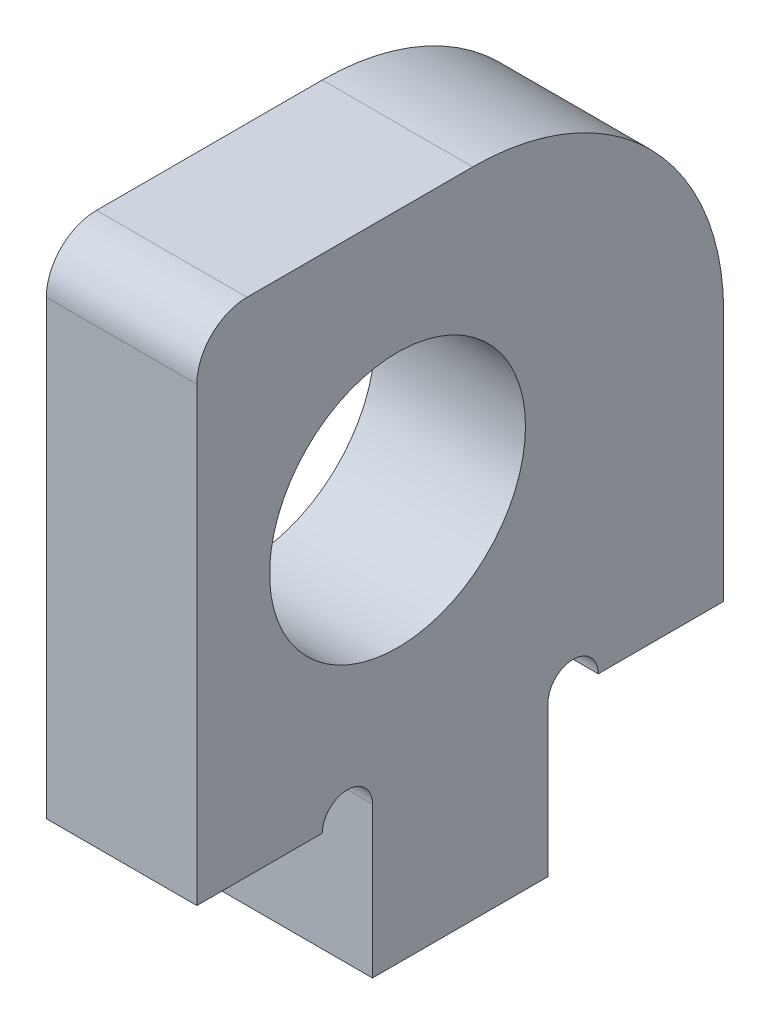
ISO-10303-21;
HEADER;
FILE_DESCRIPTION(('STEP AP214'),'2;1');
FILE_NAME('part.step','',(''),(''),'','','');
FILE_SCHEMA(('AUTOMOTIVE_DESIGN { 1 0 10303 214 1 1 1 1 }'));
ENDSEC;
DATA;
#1=APPLICATION_CONTEXT('core data for automotive mechanical design processes');
#2=APPLICATION_PROTOCOL_DEFINITION('international standard','automotive_design',2000,#1);
#3=PRODUCT_CONTEXT('',#1,'mechanical');
#4=PRODUCT('Part','Part','',(#3));
#5=PRODUCT_RELATED_PRODUCT_CATEGORY('part','',(#4));
#6=PRODUCT_DEFINITION_FORMATION('','',#4);
#7=PRODUCT_DEFINITION_CONTEXT('part definition',#1,'design');
#8=PRODUCT_DEFINITION('design','',#6,#7);
#9=PRODUCT_DEFINITION_SHAPE('','',#8);
#10=(LENGTH_UNIT() NAMED_UNIT(*) SI_UNIT(.MILLI.,.METRE.));
#11=(NAMED_UNIT(*) PLANE_ANGLE_UNIT() SI_UNIT($,.RADIAN.));
#12=(NAMED_UNIT(*) SI_UNIT($,.STERADIAN.) SOLID_ANGLE_UNIT());
#13=UNCERTAINTY_MEASURE_WITH_UNIT(LENGTH_MEASURE(1.E-05),#10,'distance_accuracy_value','');
#14=(GEOMETRIC_REPRESENTATION_CONTEXT(3) GLOBAL_UNCERTAINTY_ASSIGNED_CONTEXT((#13)) GLOBAL_UNIT_ASSIGNED_CONTEXT((#10,
#11,#12)) REPRESENTATION_CONTEXT('',''));
#15=CARTESIAN_POINT('',(0.,0.,0.));
#16=DIRECTION('',(0.,0.,1.));
#17=DIRECTION('',(1.,0.,0.));
#18=AXIS2_PLACEMENT_3D('',#15,#16,#17);
#19=CARTESIAN_POINT('',(6.,0.,0.));
#20=DIRECTION('',(0.,1.,0.));
#21=DIRECTION('',(0.,0.,1.));
#22=AXIS2_PLACEMENT_3D('',#19,#20,#21);
#23=PLANE('',#22);
#24=DIRECTION('',(0.,0.,-1.));
#25=VECTOR('',#24,1.);
#26=CARTESIAN_POINT('',(6.,0.,0.));
#27=LINE('',#26,#25);
#28=CARTESIAN_POINT('',(6.,0.,-16.));
#29=VERTEX_POINT('',#28);
#30=CARTESIAN_POINT('',(6.,0.,-21.));
#31=VERTEX_POINT('',#30);
#32=EDGE_CURVE('E38',#29,#31,#27,.T.);
#33=ORIENTED_EDGE('',*,*,#32,.F.);
#34=DIRECTION('',(1.,0.,0.));
#35=VECTOR('',#34,1.);
#36=CARTESIAN_POINT('',(-4.,0.,-16.));
#37=LINE('',#36,#35);
#38=CARTESIAN_POINT('',(0.,0.,-16.));
#39=VERTEX_POINT('',#38);
#40=EDGE_CURVE('E153',#29,#39,#37,.F.);
#41=ORIENTED_EDGE('',*,*,#40,.T.);
#42=DIRECTION('',(0.,0.,-1.));
#43=VECTOR('',#42,1.);
#44=CARTESIAN_POINT('',(0.,0.,0.));
#45=LINE('',#44,#43);
#46=CARTESIAN_POINT('',(0.,0.,-21.));
#47=VERTEX_POINT('',#46);
#48=EDGE_CURVE('E188',#39,#47,#45,.T.);
#49=ORIENTED_EDGE('',*,*,#48,.T.);
#50=DIRECTION('',(-1.,0.,0.));
#51=VECTOR('',#50,1.);
#52=CARTESIAN_POINT('',(6.,0.,-21.));
#53=LINE('',#52,#51);
#54=EDGE_CURVE('E216',#31,#47,#53,.T.);
#55=ORIENTED_EDGE('',*,*,#54,.F.);
#56=EDGE_LOOP('',(#33,#41,#49,#55));
#57=FACE_BOUND('',#56,.T.);
#58=ADVANCED_FACE('F34',(#57),#23,.F.);
#59=CARTESIAN_POINT('',(6.,0.,0.));
#60=DIRECTION('',(-1.,0.,0.));
#61=DIRECTION('',(0.,0.,1.));
#62=AXIS2_PLACEMENT_3D('',#59,#60,#61);
#63=PLANE('',#62);
#64=CARTESIAN_POINT('',(6.,0.,0.));
#65=VERTEX_POINT('',#64);
#66=CARTESIAN_POINT('',(6.,0.,-5.));
#67=VERTEX_POINT('',#66);
#68=EDGE_CURVE('E147',#65,#67,#27,.T.);
#69=ORIENTED_EDGE('',*,*,#68,.T.);
#70=CARTESIAN_POINT('',(6.,0.,-6.));
#71=DIRECTION('',(1.,0.,0.));
#72=DIRECTION('',(0.,0.,-1.));
#73=AXIS2_PLACEMENT_3D('',#70,#71,#72);
#74=CIRCLE('',#73,1.);
#75=CARTESIAN_POINT('',(6.,0.,-7.));
#76=VERTEX_POINT('',#75);
#77=EDGE_CURVE('E128',#76,#67,#74,.T.);
#78=ORIENTED_EDGE('',*,*,#77,.F.);
#79=DIRECTION('',(0.,-1.,0.));
#80=VECTOR('',#79,1.);
#81=CARTESIAN_POINT('',(6.,0.,-7.));
#82=LINE('',#81,#80);
#83=CARTESIAN_POINT('',(6.,-6.,-7.));
#84=VERTEX_POINT('',#83);
#85=EDGE_CURVE('E145',#76,#84,#82,.T.);
#86=ORIENTED_EDGE('',*,*,#85,.T.);
#87=DIRECTION('',(0.,0.,-1.));
#88=VECTOR('',#87,1.);
#89=CARTESIAN_POINT('',(6.,-6.,-7.));
#90=LINE('',#89,#88);
#91=CARTESIAN_POINT('',(6.,-6.,-14.));
#92=VERTEX_POINT('',#91);
#93=EDGE_CURVE('E152',#84,#92,#90,.T.);
#94=ORIENTED_EDGE('',*,*,#93,.T.);
#95=DIRECTION('',(0.,1.,0.));
#96=VECTOR('',#95,1.);
#97=CARTESIAN_POINT('',(6.,0.,-14.));
#98=LINE('',#97,#96);
#99=CARTESIAN_POINT('',(6.,0.,-14.));
#100=VERTEX_POINT('',#99);
#101=EDGE_CURVE('E155',#92,#100,#98,.T.);
#102=ORIENTED_EDGE('',*,*,#101,.T.);
#103=CARTESIAN_POINT('',(6.,0.,-15.));
#104=DIRECTION('',(1.,0.,0.));
#105=DIRECTION('',(0.,0.,-1.));
#106=AXIS2_PLACEMENT_3D('',#103,#104,#105);
#107=CIRCLE('',#106,1.);
#108=EDGE_CURVE('E257',#29,#100,#107,.T.);
#109=ORIENTED_EDGE('',*,*,#108,.F.);
#110=ORIENTED_EDGE('',*,*,#32,.T.);
#111=DIRECTION('',(0.,1.,0.));
#112=VECTOR('',#111,1.);
#113=CARTESIAN_POINT('',(6.,20.,-21.));
#114=LINE('',#113,#112);
#115=CARTESIAN_POINT('',(6.,10.,-21.));
#116=VERTEX_POINT('',#115);
#117=EDGE_CURVE('E239',#31,#116,#114,.T.);
#118=ORIENTED_EDGE('',*,*,#117,.T.);
#119=CARTESIAN_POINT('',(6.,10.,-11.));
#120=DIRECTION('',(-1.,0.,0.));
#121=DIRECTION('',(0.,0.,1.));
#122=AXIS2_PLACEMENT_3D('',#119,#120,#121);
#123=CIRCLE('',#122,10.);
#124=CARTESIAN_POINT('',(6.,20.,-11.));
#125=VERTEX_POINT('',#124);
#126=EDGE_CURVE('E207',#116,#125,#123,.F.);
#127=ORIENTED_EDGE('',*,*,#126,.T.);
#128=DIRECTION('',(0.,0.,1.));
#129=VECTOR('',#128,1.);
#130=CARTESIAN_POINT('',(6.,20.,0.));
#131=LINE('',#130,#129);
#132=CARTESIAN_POINT('',(6.,20.,-2.));
#133=VERTEX_POINT('',#132);
#134=EDGE_CURVE('E237',#125,#133,#131,.T.);
#135=ORIENTED_EDGE('',*,*,#134,.T.);
#136=CARTESIAN_POINT('',(6.,18.,-2.));
#137=DIRECTION('',(-1.,0.,0.));
#138=DIRECTION('',(0.,0.,1.));
#139=AXIS2_PLACEMENT_3D('',#136,#137,#138);
#140=CIRCLE('',#139,2.);
#141=CARTESIAN_POINT('',(6.,18.,0.));
#142=VERTEX_POINT('',#141);
#143=EDGE_CURVE('E11',#133,#142,#140,.F.);
#144=ORIENTED_EDGE('',*,*,#143,.T.);
#145=DIRECTION('',(0.,-1.,0.));
#146=VECTOR('',#145,1.);
#147=CARTESIAN_POINT('',(6.,0.,0.));
#148=LINE('',#147,#146);
#149=EDGE_CURVE('E195',#142,#65,#148,.T.);
#150=ORIENTED_EDGE('',*,*,#149,.T.);
#151=EDGE_LOOP('',(#69,#78,#86,#94,#102,#109,#110,#118,#127,#135,#144,#150));
#152=FACE_BOUND('',#151,.T.);
#153=CARTESIAN_POINT('',(6.,10.,-8.));
#154=DIRECTION('',(1.,0.,0.));
#155=DIRECTION('',(0.,0.,-1.));
#156=AXIS2_PLACEMENT_3D('',#153,#154,#155);
#157=CIRCLE('',#156,5.1);
#158=CARTESIAN_POINT('',(6.,10.,-13.1));
#159=VERTEX_POINT('',#158);
#160=EDGE_CURVE('E191',#159,#159,#157,.T.);
#161=ORIENTED_EDGE('',*,*,#160,.F.);
#162=EDGE_LOOP('',(#161));
#163=FACE_BOUND('',#162,.T.);
#164=ADVANCED_FACE('F142',(#152,#163),#63,.F.);
#165=CARTESIAN_POINT('',(0.,0.,0.));
#166=DIRECTION('',(-1.,0.,0.));
#167=DIRECTION('',(0.,0.,1.));
#168=AXIS2_PLACEMENT_3D('',#165,#166,#167);
#169=PLANE('',#168);
#170=CARTESIAN_POINT('',(0.,0.,-6.));
#171=DIRECTION('',(-1.,0.,0.));
#172=DIRECTION('',(0.,0.,1.));
#173=AXIS2_PLACEMENT_3D('',#170,#171,#172);
#174=CIRCLE('',#173,1.);
#175=CARTESIAN_POINT('',(0.,0.,-5.));
#176=VERTEX_POINT('',#175);
#177=CARTESIAN_POINT('',(0.,0.,-7.));
#178=VERTEX_POINT('',#177);
#179=EDGE_CURVE('E131',#176,#178,#174,.T.);
#180=ORIENTED_EDGE('',*,*,#179,.F.);
#181=CARTESIAN_POINT('',(0.,0.,0.));
#182=VERTEX_POINT('',#181);
#183=EDGE_CURVE('E190',#182,#176,#45,.T.);
#184=ORIENTED_EDGE('',*,*,#183,.F.);
#185=DIRECTION('',(0.,-1.,0.));
#186=VECTOR('',#185,1.);
#187=CARTESIAN_POINT('',(0.,0.,0.));
#188=LINE('',#187,#186);
#189=CARTESIAN_POINT('',(0.,18.,0.));
#190=VERTEX_POINT('',#189);
#191=EDGE_CURVE('E222',#190,#182,#188,.T.);
#192=ORIENTED_EDGE('',*,*,#191,.F.);
#193=CARTESIAN_POINT('',(0.,18.,-2.));
#194=DIRECTION('',(-1.,0.,0.));
#195=DIRECTION('',(0.,0.,1.));
#196=AXIS2_PLACEMENT_3D('',#193,#194,#195);
#197=CIRCLE('',#196,2.);
#198=CARTESIAN_POINT('',(0.,20.,-2.));
#199=VERTEX_POINT('',#198);
#200=EDGE_CURVE('E59',#190,#199,#197,.T.);
#201=ORIENTED_EDGE('',*,*,#200,.T.);
#202=DIRECTION('',(0.,0.,1.));
#203=VECTOR('',#202,1.);
#204=CARTESIAN_POINT('',(0.,20.,0.));
#205=LINE('',#204,#203);
#206=CARTESIAN_POINT('',(0.,20.,-11.));
#207=VERTEX_POINT('',#206);
#208=EDGE_CURVE('E223',#207,#199,#205,.T.);
#209=ORIENTED_EDGE('',*,*,#208,.F.);
#210=CARTESIAN_POINT('',(0.,10.,-11.));
#211=DIRECTION('',(-1.,0.,0.));
#212=DIRECTION('',(0.,0.,1.));
#213=AXIS2_PLACEMENT_3D('',#210,#211,#212);
#214=CIRCLE('',#213,10.);
#215=CARTESIAN_POINT('',(0.,10.,-21.));
#216=VERTEX_POINT('',#215);
#217=EDGE_CURVE('E211',#207,#216,#214,.T.);
#218=ORIENTED_EDGE('',*,*,#217,.T.);
#219=DIRECTION('',(0.,1.,0.));
#220=VECTOR('',#219,1.);
#221=CARTESIAN_POINT('',(0.,20.,-21.));
#222=LINE('',#221,#220);
#223=EDGE_CURVE('E197',#47,#216,#222,.T.);
#224=ORIENTED_EDGE('',*,*,#223,.F.);
#225=ORIENTED_EDGE('',*,*,#48,.F.);
#226=CARTESIAN_POINT('',(0.,0.,-15.));
#227=DIRECTION('',(-1.,0.,0.));
#228=DIRECTION('',(0.,0.,1.));
#229=AXIS2_PLACEMENT_3D('',#226,#227,#228);
#230=CIRCLE('',#229,1.);
#231=CARTESIAN_POINT('',(0.,0.,-14.));
#232=VERTEX_POINT('',#231);
#233=EDGE_CURVE('E158',#232,#39,#230,.T.);
#234=ORIENTED_EDGE('',*,*,#233,.F.);
#235=DIRECTION('',(0.,1.,0.));
#236=VECTOR('',#235,1.);
#237=CARTESIAN_POINT('',(0.,0.,-14.));
#238=LINE('',#237,#236);
#239=CARTESIAN_POINT('',(0.,-6.,-14.));
#240=VERTEX_POINT('',#239);
#241=EDGE_CURVE('E179',#240,#232,#238,.T.);
#242=ORIENTED_EDGE('',*,*,#241,.F.);
#243=DIRECTION('',(0.,0.,-1.));
#244=VECTOR('',#243,1.);
#245=CARTESIAN_POINT('',(0.,-6.,-7.));
#246=LINE('',#245,#244);
#247=CARTESIAN_POINT('',(0.,-6.,-7.));
#248=VERTEX_POINT('',#247);
#249=EDGE_CURVE('E182',#248,#240,#246,.T.);
#250=ORIENTED_EDGE('',*,*,#249,.F.);
#251=DIRECTION('',(0.,-1.,0.));
#252=VECTOR('',#251,1.);
#253=CARTESIAN_POINT('',(0.,0.,-7.));
#254=LINE('',#253,#252);
#255=EDGE_CURVE('E166',#178,#248,#254,.T.);
#256=ORIENTED_EDGE('',*,*,#255,.F.);
#257=EDGE_LOOP('',(#180,#184,#192,#201,#209,#218,#224,#225,#234,#242,#250,#256));
#258=FACE_BOUND('',#257,.T.);
#259=CARTESIAN_POINT('',(0.,10.,-8.));
#260=DIRECTION('',(1.,0.,0.));
#261=DIRECTION('',(0.,0.,-1.));
#262=AXIS2_PLACEMENT_3D('',#259,#260,#261);
#263=CIRCLE('',#262,5.1);
#264=CARTESIAN_POINT('',(0.,10.,-13.1));
#265=VERTEX_POINT('',#264);
#266=EDGE_CURVE('E136',#265,#265,#263,.T.);
#267=ORIENTED_EDGE('',*,*,#266,.T.);
#268=EDGE_LOOP('',(#267));
#269=FACE_BOUND('',#268,.T.);
#270=ADVANCED_FACE('F264',(#258,#269),#169,.T.);
#271=ORIENTED_EDGE('',*,*,#183,.T.);
#272=DIRECTION('',(1.,0.,0.));
#273=VECTOR('',#272,1.);
#274=CARTESIAN_POINT('',(-4.,0.,-5.));
#275=LINE('',#274,#273);
#276=EDGE_CURVE('E260',#176,#67,#275,.T.);
#277=ORIENTED_EDGE('',*,*,#276,.T.);
#278=ORIENTED_EDGE('',*,*,#68,.F.);
#279=DIRECTION('',(-1.,0.,0.));
#280=VECTOR('',#279,1.);
#281=CARTESIAN_POINT('',(6.,0.,0.));
#282=LINE('',#281,#280);
#283=EDGE_CURVE('E219',#65,#182,#282,.T.);
#284=ORIENTED_EDGE('',*,*,#283,.T.);
#285=EDGE_LOOP('',(#271,#277,#278,#284));
#286=FACE_BOUND('',#285,.T.);
#287=ADVANCED_FACE('F273',(#286),#23,.F.);
#288=CARTESIAN_POINT('',(6.,20.,-21.));
#289=DIRECTION('',(0.,0.,1.));
#290=DIRECTION('',(0.,-1.,0.));
#291=AXIS2_PLACEMENT_3D('',#288,#289,#290);
#292=PLANE('',#291);
#293=ORIENTED_EDGE('',*,*,#223,.T.);
#294=DIRECTION('',(-1.,0.,0.));
#295=VECTOR('',#294,1.);
#296=CARTESIAN_POINT('',(6.,10.,-21.));
#297=LINE('',#296,#295);
#298=EDGE_CURVE('E209',#216,#116,#297,.F.);
#299=ORIENTED_EDGE('',*,*,#298,.T.);
#300=ORIENTED_EDGE('',*,*,#117,.F.);
#301=ORIENTED_EDGE('',*,*,#54,.T.);
#302=EDGE_LOOP('',(#293,#299,#300,#301));
#303=FACE_BOUND('',#302,.T.);
#304=ADVANCED_FACE('F228',(#303),#292,.F.);
#305=CARTESIAN_POINT('',(6.,20.,0.));
#306=DIRECTION('',(0.,-1.,0.));
#307=DIRECTION('',(0.,0.,-1.));
#308=AXIS2_PLACEMENT_3D('',#305,#306,#307);
#309=PLANE('',#308);
#310=ORIENTED_EDGE('',*,*,#208,.T.);
#311=DIRECTION('',(-1.,0.,0.));
#312=VECTOR('',#311,1.);
#313=CARTESIAN_POINT('',(6.,20.,-2.));
#314=LINE('',#313,#312);
#315=EDGE_CURVE('E44',#199,#133,#314,.F.);
#316=ORIENTED_EDGE('',*,*,#315,.T.);
#317=ORIENTED_EDGE('',*,*,#134,.F.);
#318=DIRECTION('',(-1.,0.,0.));
#319=VECTOR('',#318,1.);
#320=CARTESIAN_POINT('',(6.,20.,-11.));
#321=LINE('',#320,#319);
#322=EDGE_CURVE('E213',#125,#207,#321,.T.);
#323=ORIENTED_EDGE('',*,*,#322,.T.);
#324=EDGE_LOOP('',(#310,#316,#317,#323));
#325=FACE_BOUND('',#324,.T.);
#326=ADVANCED_FACE('F240',(#325),#309,.F.);
#327=CARTESIAN_POINT('',(6.,0.,0.));
#328=DIRECTION('',(0.,0.,-1.));
#329=DIRECTION('',(-1.,0.,0.));
#330=AXIS2_PLACEMENT_3D('',#327,#328,#329);
#331=PLANE('',#330);
#332=ORIENTED_EDGE('',*,*,#149,.F.);
#333=DIRECTION('',(-1.,0.,0.));
#334=VECTOR('',#333,1.);
#335=CARTESIAN_POINT('',(6.,18.,0.));
#336=LINE('',#335,#334);
#337=EDGE_CURVE('E204',#142,#190,#336,.T.);
#338=ORIENTED_EDGE('',*,*,#337,.T.);
#339=ORIENTED_EDGE('',*,*,#191,.T.);
#340=ORIENTED_EDGE('',*,*,#283,.F.);
#341=EDGE_LOOP('',(#332,#338,#339,#340));
#342=FACE_BOUND('',#341,.T.);
#343=ADVANCED_FACE('F277',(#342),#331,.F.);
#344=CARTESIAN_POINT('',(6.,10.,-8.));
#345=DIRECTION('',(-1.,0.,0.));
#346=DIRECTION('',(0.,0.,1.));
#347=AXIS2_PLACEMENT_3D('',#344,#345,#346);
#348=CYLINDRICAL_SURFACE('',#347,5.1);
#349=ORIENTED_EDGE('',*,*,#160,.T.);
#350=EDGE_LOOP('',(#349));
#351=FACE_BOUND('',#350,.T.);
#352=ORIENTED_EDGE('',*,*,#266,.F.);
#353=EDGE_LOOP('',(#352));
#354=FACE_BOUND('',#353,.T.);
#355=ADVANCED_FACE('F287',(#351,#354),#348,.F.);
#356=CARTESIAN_POINT('',(6.,10.,-11.));
#357=DIRECTION('',(-1.,0.,0.));
#358=DIRECTION('',(0.,0.,1.));
#359=AXIS2_PLACEMENT_3D('',#356,#357,#358);
#360=CYLINDRICAL_SURFACE('',#359,10.);
#361=ORIENTED_EDGE('',*,*,#126,.F.);
#362=ORIENTED_EDGE('',*,*,#298,.F.);
#363=ORIENTED_EDGE('',*,*,#217,.F.);
#364=ORIENTED_EDGE('',*,*,#322,.F.);
#365=EDGE_LOOP('',(#361,#362,#363,#364));
#366=FACE_BOUND('',#365,.T.);
#367=ADVANCED_FACE('F235',(#366),#360,.T.);
#368=CARTESIAN_POINT('',(6.,18.,-2.));
#369=DIRECTION('',(-1.,0.,0.));
#370=DIRECTION('',(0.,0.,1.));
#371=AXIS2_PLACEMENT_3D('',#368,#369,#370);
#372=CYLINDRICAL_SURFACE('',#371,2.);
#373=ORIENTED_EDGE('',*,*,#143,.F.);
#374=ORIENTED_EDGE('',*,*,#315,.F.);
#375=ORIENTED_EDGE('',*,*,#200,.F.);
#376=ORIENTED_EDGE('',*,*,#337,.F.);
#377=EDGE_LOOP('',(#373,#374,#375,#376));
#378=FACE_BOUND('',#377,.T.);
#379=ADVANCED_FACE('F36',(#378),#372,.T.);
#380=CARTESIAN_POINT('',(0.,0.,-7.));
#381=DIRECTION('',(0.,0.,1.));
#382=DIRECTION('',(1.,0.,0.));
#383=AXIS2_PLACEMENT_3D('',#380,#381,#382);
#384=PLANE('',#383);
#385=ORIENTED_EDGE('',*,*,#85,.F.);
#386=DIRECTION('',(1.,0.,0.));
#387=VECTOR('',#386,1.);
#388=CARTESIAN_POINT('',(0.,0.,-7.));
#389=LINE('',#388,#387);
#390=EDGE_CURVE('E125',#178,#76,#389,.T.);
#391=ORIENTED_EDGE('',*,*,#390,.F.);
#392=ORIENTED_EDGE('',*,*,#255,.T.);
#393=DIRECTION('',(1.,0.,0.));
#394=VECTOR('',#393,1.);
#395=CARTESIAN_POINT('',(0.,-6.,-7.));
#396=LINE('',#395,#394);
#397=EDGE_CURVE('E150',#248,#84,#396,.T.);
#398=ORIENTED_EDGE('',*,*,#397,.T.);
#399=EDGE_LOOP('',(#385,#391,#392,#398));
#400=FACE_BOUND('',#399,.T.);
#401=ADVANCED_FACE('F149',(#400),#384,.T.);
#402=CARTESIAN_POINT('',(0.,0.,-14.));
#403=DIRECTION('',(0.,0.,-1.));
#404=DIRECTION('',(-1.,0.,0.));
#405=AXIS2_PLACEMENT_3D('',#402,#403,#404);
#406=PLANE('',#405);
#407=ORIENTED_EDGE('',*,*,#101,.F.);
#408=DIRECTION('',(1.,0.,0.));
#409=VECTOR('',#408,1.);
#410=CARTESIAN_POINT('',(0.,-6.,-14.));
#411=LINE('',#410,#409);
#412=EDGE_CURVE('E173',#240,#92,#411,.T.);
#413=ORIENTED_EDGE('',*,*,#412,.F.);
#414=ORIENTED_EDGE('',*,*,#241,.T.);
#415=DIRECTION('',(1.,0.,0.));
#416=VECTOR('',#415,1.);
#417=CARTESIAN_POINT('',(0.,0.,-14.));
#418=LINE('',#417,#416);
#419=EDGE_CURVE('E137',#232,#100,#418,.T.);
#420=ORIENTED_EDGE('',*,*,#419,.T.);
#421=EDGE_LOOP('',(#407,#413,#414,#420));
#422=FACE_BOUND('',#421,.T.);
#423=ADVANCED_FACE('F255',(#422),#406,.T.);
#424=CARTESIAN_POINT('',(0.,-6.,-7.));
#425=DIRECTION('',(0.,-1.,0.));
#426=DIRECTION('',(0.,0.,-1.));
#427=AXIS2_PLACEMENT_3D('',#424,#425,#426);
#428=PLANE('',#427);
#429=ORIENTED_EDGE('',*,*,#93,.F.);
#430=ORIENTED_EDGE('',*,*,#397,.F.);
#431=ORIENTED_EDGE('',*,*,#249,.T.);
#432=ORIENTED_EDGE('',*,*,#412,.T.);
#433=EDGE_LOOP('',(#429,#430,#431,#432));
#434=FACE_BOUND('',#433,.T.);
#435=ADVANCED_FACE('F251',(#434),#428,.T.);
#436=CARTESIAN_POINT('',(-4.,0.,-15.));
#437=DIRECTION('',(1.,0.,0.));
#438=DIRECTION('',(0.,0.,-1.));
#439=AXIS2_PLACEMENT_3D('',#436,#437,#438);
#440=CYLINDRICAL_SURFACE('',#439,1.);
#441=ORIENTED_EDGE('',*,*,#108,.T.);
#442=ORIENTED_EDGE('',*,*,#419,.F.);
#443=ORIENTED_EDGE('',*,*,#233,.T.);
#444=ORIENTED_EDGE('',*,*,#40,.F.);
#445=EDGE_LOOP('',(#441,#442,#443,#444));
#446=FACE_BOUND('',#445,.T.);
#447=ADVANCED_FACE('F371',(#446),#440,.F.);
#448=CARTESIAN_POINT('',(-4.,0.,-6.));
#449=DIRECTION('',(1.,0.,0.));
#450=DIRECTION('',(0.,0.,-1.));
#451=AXIS2_PLACEMENT_3D('',#448,#449,#450);
#452=CYLINDRICAL_SURFACE('',#451,1.);
#453=ORIENTED_EDGE('',*,*,#179,.T.);
#454=ORIENTED_EDGE('',*,*,#390,.T.);
#455=ORIENTED_EDGE('',*,*,#77,.T.);
#456=ORIENTED_EDGE('',*,*,#276,.F.);
#457=EDGE_LOOP('',(#453,#454,#455,#456));
#458=FACE_BOUND('',#457,.T.);
#459=ADVANCED_FACE('F127',(#458),#452,.F.);
#460=CLOSED_SHELL('',(#58,#164,#270,#287,#304,#326,#343,#355,#367,#379,#401,#423,#435,#447,#459));
#461=MANIFOLD_SOLID_BREP('B2',#460);
#462=ADVANCED_BREP_SHAPE_REPRESENTATION('',(#18,#461),#14);
#463=SHAPE_DEFINITION_REPRESENTATION(#9,#462);
ENDSEC;
END-ISO-10303-21;
